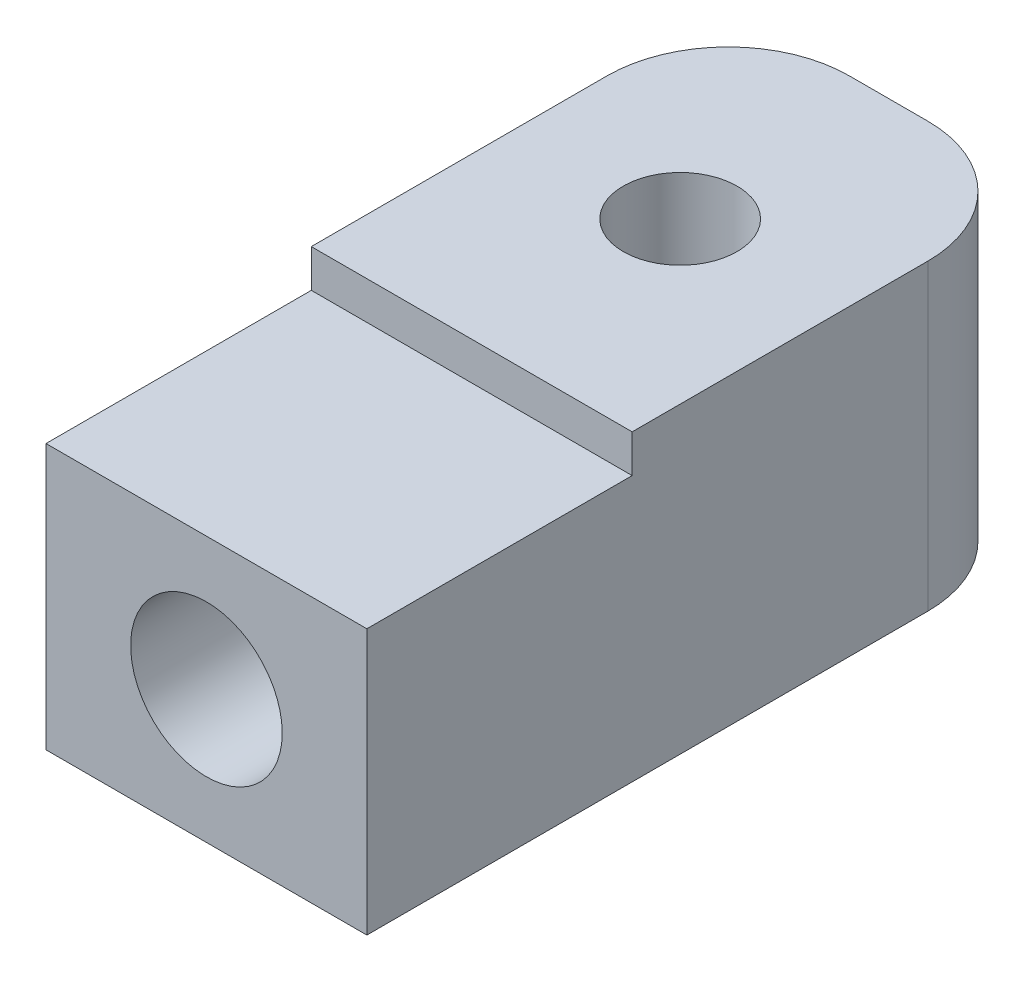
ISO-10303-21;
HEADER;
FILE_DESCRIPTION(('STEP AP214'),'2;1');
FILE_NAME('part.step','',(''),(''),'','','');
FILE_SCHEMA(('AUTOMOTIVE_DESIGN { 1 0 10303 214 1 1 1 1 }'));
ENDSEC;
DATA;
#1=APPLICATION_CONTEXT('core data for automotive mechanical design processes');
#2=APPLICATION_PROTOCOL_DEFINITION('international standard','automotive_design',2000,#1);
#3=PRODUCT_CONTEXT('',#1,'mechanical');
#4=PRODUCT('Part','Part','',(#3));
#5=PRODUCT_RELATED_PRODUCT_CATEGORY('part','',(#4));
#6=PRODUCT_DEFINITION_FORMATION('','',#4);
#7=PRODUCT_DEFINITION_CONTEXT('part definition',#1,'design');
#8=PRODUCT_DEFINITION('design','',#6,#7);
#9=PRODUCT_DEFINITION_SHAPE('','',#8);
#10=(LENGTH_UNIT() NAMED_UNIT(*) SI_UNIT(.MILLI.,.METRE.));
#11=(NAMED_UNIT(*) PLANE_ANGLE_UNIT() SI_UNIT($,.RADIAN.));
#12=(NAMED_UNIT(*) SI_UNIT($,.STERADIAN.) SOLID_ANGLE_UNIT());
#13=UNCERTAINTY_MEASURE_WITH_UNIT(LENGTH_MEASURE(1.E-05),#10,'distance_accuracy_value','');
#14=(GEOMETRIC_REPRESENTATION_CONTEXT(3) GLOBAL_UNCERTAINTY_ASSIGNED_CONTEXT((#13)) GLOBAL_UNIT_ASSIGNED_CONTEXT((#10,
#11,#12)) REPRESENTATION_CONTEXT('',''));
#15=CARTESIAN_POINT('',(0.,0.,0.));
#16=DIRECTION('',(0.,0.,1.));
#17=DIRECTION('',(1.,0.,0.));
#18=AXIS2_PLACEMENT_3D('',#15,#16,#17);
#19=CARTESIAN_POINT('',(-110.647826802209,1000.,0.));
#20=DIRECTION('',(-1.,0.,0.));
#21=DIRECTION('',(0.,0.,1.));
#22=AXIS2_PLACEMENT_3D('',#19,#20,#21);
#23=PLANE('',#22);
#24=DIRECTION('',(0.,0.,-1.));
#25=VECTOR('',#24,1.);
#26=CARTESIAN_POINT('',(-110.647826802209,1000.,0.));
#27=LINE('',#26,#25);
#28=CARTESIAN_POINT('',(-110.647826802209,1000.,444.08422626617));
#29=VERTEX_POINT('',#28);
#30=CARTESIAN_POINT('',(-110.647826802209,1000.,-530.915773733829));
#31=VERTEX_POINT('',#30);
#32=EDGE_CURVE('E134',#29,#31,#27,.T.);
#33=ORIENTED_EDGE('',*,*,#32,.T.);
#34=DIRECTION('',(0.,-1.,0.));
#35=VECTOR('',#34,1.);
#36=CARTESIAN_POINT('',(-110.647826802209,0.,-530.915773733829));
#37=LINE('',#36,#35);
#38=CARTESIAN_POINT('',(-110.647826802209,0.,-530.915773733829));
#39=VERTEX_POINT('',#38);
#40=EDGE_CURVE('E152',#31,#39,#37,.T.);
#41=ORIENTED_EDGE('',*,*,#40,.T.);
#42=DIRECTION('',(0.,0.,-1.));
#43=VECTOR('',#42,1.);
#44=CARTESIAN_POINT('',(-110.647826802209,0.,0.));
#45=LINE('',#44,#43);
#46=CARTESIAN_POINT('',(-110.647826802209,0.,1319.08422626617));
#47=VERTEX_POINT('',#46);
#48=EDGE_CURVE('E106',#47,#39,#45,.T.);
#49=ORIENTED_EDGE('',*,*,#48,.F.);
#50=DIRECTION('',(0.,-1.,0.));
#51=VECTOR('',#50,1.);
#52=CARTESIAN_POINT('',(-110.647826802209,875.,1319.08422626617));
#53=LINE('',#52,#51);
#54=CARTESIAN_POINT('',(-110.647826802209,875.,1319.08422626617));
#55=VERTEX_POINT('',#54);
#56=EDGE_CURVE('E99',#55,#47,#53,.T.);
#57=ORIENTED_EDGE('',*,*,#56,.F.);
#58=DIRECTION('',(0.,0.,-1.));
#59=VECTOR('',#58,1.);
#60=CARTESIAN_POINT('',(-110.647826802209,875.,0.));
#61=LINE('',#60,#59);
#62=CARTESIAN_POINT('',(-110.647826802209,875.,444.08422626617));
#63=VERTEX_POINT('',#62);
#64=EDGE_CURVE('E102',#55,#63,#61,.T.);
#65=ORIENTED_EDGE('',*,*,#64,.T.);
#66=DIRECTION('',(0.,-1.,0.));
#67=VECTOR('',#66,1.);
#68=CARTESIAN_POINT('',(-110.647826802209,1000.,444.08422626617));
#69=LINE('',#68,#67);
#70=EDGE_CURVE('E150',#29,#63,#69,.T.);
#71=ORIENTED_EDGE('',*,*,#70,.F.);
#72=EDGE_LOOP('',(#33,#41,#49,#57,#65,#71));
#73=FACE_BOUND('',#72,.T.);
#74=ADVANCED_FACE('F33',(#73),#23,.T.);
#75=CARTESIAN_POINT('',(0.,1000.,444.08422626617));
#76=DIRECTION('',(0.,0.,-1.));
#77=DIRECTION('',(-1.,0.,0.));
#78=AXIS2_PLACEMENT_3D('',#75,#76,#77);
#79=PLANE('',#78);
#80=ORIENTED_EDGE('',*,*,#70,.T.);
#81=DIRECTION('',(1.,0.,0.));
#82=VECTOR('',#81,1.);
#83=CARTESIAN_POINT('',(0.,875.,444.08422626617));
#84=LINE('',#83,#82);
#85=CARTESIAN_POINT('',(947.649778023491,875.,444.08422626617));
#86=VERTEX_POINT('',#85);
#87=EDGE_CURVE('E118',#63,#86,#84,.T.);
#88=ORIENTED_EDGE('',*,*,#87,.T.);
#89=DIRECTION('',(0.,-1.,0.));
#90=VECTOR('',#89,1.);
#91=CARTESIAN_POINT('',(947.649778023491,1000.,444.08422626617));
#92=LINE('',#91,#90);
#93=CARTESIAN_POINT('',(947.649778023491,1000.,444.08422626617));
#94=VERTEX_POINT('',#93);
#95=EDGE_CURVE('E143',#94,#86,#92,.T.);
#96=ORIENTED_EDGE('',*,*,#95,.F.);
#97=DIRECTION('',(1.,0.,0.));
#98=VECTOR('',#97,1.);
#99=CARTESIAN_POINT('',(0.,1000.,444.08422626617));
#100=LINE('',#99,#98);
#101=EDGE_CURVE('E136',#29,#94,#100,.T.);
#102=ORIENTED_EDGE('',*,*,#101,.F.);
#103=EDGE_LOOP('',(#80,#88,#96,#102));
#104=FACE_BOUND('',#103,.T.);
#105=ADVANCED_FACE('F181',(#104),#79,.F.);
#106=CARTESIAN_POINT('',(947.649778023491,1000.,0.));
#107=DIRECTION('',(-1.,0.,0.));
#108=DIRECTION('',(0.,0.,1.));
#109=AXIS2_PLACEMENT_3D('',#106,#107,#108);
#110=PLANE('',#109);
#111=DIRECTION('',(0.,0.,-1.));
#112=VECTOR('',#111,1.);
#113=CARTESIAN_POINT('',(947.649778023491,0.,0.));
#114=LINE('',#113,#112);
#115=CARTESIAN_POINT('',(947.649778023491,0.,1319.08422626617));
#116=VERTEX_POINT('',#115);
#117=CARTESIAN_POINT('',(947.649778023491,0.,-530.915773733829));
#118=VERTEX_POINT('',#117);
#119=EDGE_CURVE('E145',#116,#118,#114,.T.);
#120=ORIENTED_EDGE('',*,*,#119,.T.);
#121=DIRECTION('',(0.,-1.,0.));
#122=VECTOR('',#121,1.);
#123=CARTESIAN_POINT('',(947.649778023491,1000.,-530.915773733829));
#124=LINE('',#123,#122);
#125=CARTESIAN_POINT('',(947.649778023491,1000.,-530.915773733829));
#126=VERTEX_POINT('',#125);
#127=EDGE_CURVE('E11',#118,#126,#124,.F.);
#128=ORIENTED_EDGE('',*,*,#127,.T.);
#129=DIRECTION('',(0.,0.,-1.));
#130=VECTOR('',#129,1.);
#131=CARTESIAN_POINT('',(947.649778023491,1000.,0.));
#132=LINE('',#131,#130);
#133=EDGE_CURVE('E139',#94,#126,#132,.T.);
#134=ORIENTED_EDGE('',*,*,#133,.F.);
#135=ORIENTED_EDGE('',*,*,#95,.T.);
#136=DIRECTION('',(0.,0.,-1.));
#137=VECTOR('',#136,1.);
#138=CARTESIAN_POINT('',(947.649778023491,875.,0.));
#139=LINE('',#138,#137);
#140=CARTESIAN_POINT('',(947.649778023491,875.,1319.08422626617));
#141=VERTEX_POINT('',#140);
#142=EDGE_CURVE('E125',#141,#86,#139,.T.);
#143=ORIENTED_EDGE('',*,*,#142,.F.);
#144=DIRECTION('',(0.,-1.,0.));
#145=VECTOR('',#144,1.);
#146=CARTESIAN_POINT('',(947.649778023491,875.,1319.08422626617));
#147=LINE('',#146,#145);
#148=EDGE_CURVE('E111',#141,#116,#147,.T.);
#149=ORIENTED_EDGE('',*,*,#148,.T.);
#150=EDGE_LOOP('',(#120,#128,#134,#135,#143,#149));
#151=FACE_BOUND('',#150,.T.);
#152=ADVANCED_FACE('F178',(#151),#110,.F.);
#153=CARTESIAN_POINT('',(-1.95318239647015E-13,1000.,-930.915773733829));
#154=DIRECTION('',(0.,0.,1.));
#155=DIRECTION('',(1.,0.,0.));
#156=AXIS2_PLACEMENT_3D('',#153,#154,#155);
#157=PLANE('',#156);
#158=DIRECTION('',(-1.,0.,0.));
#159=VECTOR('',#158,1.);
#160=CARTESIAN_POINT('',(-1.95318239647015E-13,0.,-930.915773733829));
#161=LINE('',#160,#159);
#162=CARTESIAN_POINT('',(547.649778023491,0.,-930.915773733829));
#163=VERTEX_POINT('',#162);
#164=CARTESIAN_POINT('',(289.352173197791,0.,-930.915773733829));
#165=VERTEX_POINT('',#164);
#166=EDGE_CURVE('E137',#163,#165,#161,.T.);
#167=ORIENTED_EDGE('',*,*,#166,.T.);
#168=DIRECTION('',(0.,-1.,0.));
#169=VECTOR('',#168,1.);
#170=CARTESIAN_POINT('',(289.352173197791,1000.,-930.915773733829));
#171=LINE('',#170,#169);
#172=CARTESIAN_POINT('',(289.352173197791,1000.,-930.915773733829));
#173=VERTEX_POINT('',#172);
#174=EDGE_CURVE('E54',#165,#173,#171,.F.);
#175=ORIENTED_EDGE('',*,*,#174,.T.);
#176=DIRECTION('',(-1.,0.,0.));
#177=VECTOR('',#176,1.);
#178=CARTESIAN_POINT('',(-1.95318239647015E-13,1000.,-930.915773733829));
#179=LINE('',#178,#177);
#180=CARTESIAN_POINT('',(547.649778023491,1000.,-930.915773733829));
#181=VERTEX_POINT('',#180);
#182=EDGE_CURVE('E141',#181,#173,#179,.T.);
#183=ORIENTED_EDGE('',*,*,#182,.F.);
#184=DIRECTION('',(0.,-1.,0.));
#185=VECTOR('',#184,1.);
#186=CARTESIAN_POINT('',(547.649778023491,1000.,-930.915773733829));
#187=LINE('',#186,#185);
#188=EDGE_CURVE('E158',#181,#163,#187,.T.);
#189=ORIENTED_EDGE('',*,*,#188,.T.);
#190=EDGE_LOOP('',(#167,#175,#183,#189));
#191=FACE_BOUND('',#190,.T.);
#192=ADVANCED_FACE('F174',(#191),#157,.F.);
#193=CARTESIAN_POINT('',(0.,1000.,0.));
#194=DIRECTION('',(0.,1.,0.));
#195=DIRECTION('',(0.,0.,1.));
#196=AXIS2_PLACEMENT_3D('',#193,#194,#195);
#197=PLANE('',#196);
#198=CARTESIAN_POINT('',(418.500975610641,1000.,-243.415773733829));
#199=DIRECTION('',(0.,1.,0.));
#200=DIRECTION('',(0.,0.,1.));
#201=AXIS2_PLACEMENT_3D('',#198,#199,#200);
#202=CIRCLE('',#201,187.5);
#203=CARTESIAN_POINT('',(418.500975610641,1000.,-55.9157737338296));
#204=VERTEX_POINT('',#203);
#205=EDGE_CURVE('E341',#204,#204,#202,.T.);
#206=ORIENTED_EDGE('',*,*,#205,.F.);
#207=EDGE_LOOP('',(#206));
#208=FACE_BOUND('',#207,.T.);
#209=ORIENTED_EDGE('',*,*,#182,.T.);
#210=CARTESIAN_POINT('',(289.352173197791,1000.,-530.915773733829));
#211=DIRECTION('',(0.,1.,0.));
#212=DIRECTION('',(0.,0.,1.));
#213=AXIS2_PLACEMENT_3D('',#210,#211,#212);
#214=CIRCLE('',#213,400.);
#215=EDGE_CURVE('E41',#173,#31,#214,.T.);
#216=ORIENTED_EDGE('',*,*,#215,.T.);
#217=ORIENTED_EDGE('',*,*,#32,.F.);
#218=ORIENTED_EDGE('',*,*,#101,.T.);
#219=ORIENTED_EDGE('',*,*,#133,.T.);
#220=CARTESIAN_POINT('',(547.649778023491,1000.,-530.915773733829));
#221=DIRECTION('',(0.,1.,0.));
#222=DIRECTION('',(0.,0.,1.));
#223=AXIS2_PLACEMENT_3D('',#220,#221,#222);
#224=CIRCLE('',#223,400.);
#225=EDGE_CURVE('E162',#126,#181,#224,.T.);
#226=ORIENTED_EDGE('',*,*,#225,.T.);
#227=EDGE_LOOP('',(#209,#216,#217,#218,#219,#226));
#228=FACE_BOUND('',#227,.T.);
#229=ADVANCED_FACE('F166',(#208,#228),#197,.T.);
#230=CARTESIAN_POINT('',(0.,0.,0.));
#231=DIRECTION('',(0.,1.,0.));
#232=DIRECTION('',(0.,0.,1.));
#233=AXIS2_PLACEMENT_3D('',#230,#231,#232);
#234=PLANE('',#233);
#235=CARTESIAN_POINT('',(418.500975610641,0.,-243.415773733829));
#236=DIRECTION('',(0.,-1.,0.));
#237=DIRECTION('',(0.,0.,-1.));
#238=AXIS2_PLACEMENT_3D('',#235,#236,#237);
#239=CIRCLE('',#238,237.5);
#240=CARTESIAN_POINT('',(418.500975610641,0.,-480.915773733829));
#241=VERTEX_POINT('',#240);
#242=EDGE_CURVE('E332',#241,#241,#239,.T.);
#243=ORIENTED_EDGE('',*,*,#242,.F.);
#244=EDGE_LOOP('',(#243));
#245=FACE_BOUND('',#244,.T.);
#246=ORIENTED_EDGE('',*,*,#48,.T.);
#247=CARTESIAN_POINT('',(289.352173197791,0.,-530.915773733829));
#248=DIRECTION('',(0.,1.,0.));
#249=DIRECTION('',(0.,0.,1.));
#250=AXIS2_PLACEMENT_3D('',#247,#248,#249);
#251=CIRCLE('',#250,400.);
#252=EDGE_CURVE('E156',#39,#165,#251,.F.);
#253=ORIENTED_EDGE('',*,*,#252,.T.);
#254=ORIENTED_EDGE('',*,*,#166,.F.);
#255=CARTESIAN_POINT('',(547.649778023491,0.,-530.915773733829));
#256=DIRECTION('',(0.,1.,0.));
#257=DIRECTION('',(0.,0.,1.));
#258=AXIS2_PLACEMENT_3D('',#255,#256,#257);
#259=CIRCLE('',#258,400.);
#260=EDGE_CURVE('E154',#163,#118,#259,.F.);
#261=ORIENTED_EDGE('',*,*,#260,.T.);
#262=ORIENTED_EDGE('',*,*,#119,.F.);
#263=DIRECTION('',(-1.,0.,0.));
#264=VECTOR('',#263,1.);
#265=CARTESIAN_POINT('',(0.,0.,1319.08422626617));
#266=LINE('',#265,#264);
#267=EDGE_CURVE('E120',#116,#47,#266,.T.);
#268=ORIENTED_EDGE('',*,*,#267,.T.);
#269=EDGE_LOOP('',(#246,#253,#254,#261,#262,#268));
#270=FACE_BOUND('',#269,.T.);
#271=ADVANCED_FACE('F173',(#245,#270),#234,.F.);
#272=CARTESIAN_POINT('',(0.,875.,1319.08422626617));
#273=DIRECTION('',(0.,0.,1.));
#274=DIRECTION('',(1.,0.,0.));
#275=AXIS2_PLACEMENT_3D('',#272,#273,#274);
#276=PLANE('',#275);
#277=CARTESIAN_POINT('',(418.500975610641,437.5,1319.08422626617));
#278=DIRECTION('',(0.,0.,1.));
#279=DIRECTION('',(1.,0.,0.));
#280=AXIS2_PLACEMENT_3D('',#277,#278,#279);
#281=CIRCLE('',#280,250.);
#282=CARTESIAN_POINT('',(668.500975610641,437.5,1319.08422626617));
#283=VERTEX_POINT('',#282);
#284=EDGE_CURVE('E344',#283,#283,#281,.T.);
#285=ORIENTED_EDGE('',*,*,#284,.F.);
#286=EDGE_LOOP('',(#285));
#287=FACE_BOUND('',#286,.T.);
#288=ORIENTED_EDGE('',*,*,#267,.F.);
#289=ORIENTED_EDGE('',*,*,#148,.F.);
#290=DIRECTION('',(-1.,0.,0.));
#291=VECTOR('',#290,1.);
#292=CARTESIAN_POINT('',(0.,875.,1319.08422626617));
#293=LINE('',#292,#291);
#294=EDGE_CURVE('E116',#141,#55,#293,.T.);
#295=ORIENTED_EDGE('',*,*,#294,.T.);
#296=ORIENTED_EDGE('',*,*,#56,.T.);
#297=EDGE_LOOP('',(#288,#289,#295,#296));
#298=FACE_BOUND('',#297,.T.);
#299=ADVANCED_FACE('F122',(#287,#298),#276,.T.);
#300=CARTESIAN_POINT('',(0.,875.,0.));
#301=DIRECTION('',(0.,1.,0.));
#302=DIRECTION('',(0.,0.,1.));
#303=AXIS2_PLACEMENT_3D('',#300,#301,#302);
#304=PLANE('',#303);
#305=ORIENTED_EDGE('',*,*,#64,.F.);
#306=ORIENTED_EDGE('',*,*,#294,.F.);
#307=ORIENTED_EDGE('',*,*,#142,.T.);
#308=ORIENTED_EDGE('',*,*,#87,.F.);
#309=EDGE_LOOP('',(#305,#306,#307,#308));
#310=FACE_BOUND('',#309,.T.);
#311=ADVANCED_FACE('F115',(#310),#304,.T.);
#312=CARTESIAN_POINT('',(418.500975610641,437.5,131.08422626617));
#313=DIRECTION('',(0.,0.,1.));
#314=DIRECTION('',(1.,0.,0.));
#315=AXIS2_PLACEMENT_3D('',#312,#313,#314);
#316=CYLINDRICAL_SURFACE('',#315,250.);
#317=CARTESIAN_POINT('',(418.500975610641,437.5,131.08422626617));
#318=DIRECTION('',(0.,0.,1.));
#319=DIRECTION('',(1.,0.,0.));
#320=AXIS2_PLACEMENT_3D('',#317,#318,#319);
#321=CIRCLE('',#320,250.);
#322=CARTESIAN_POINT('',(668.500975610641,437.5,131.08422626617));
#323=VERTEX_POINT('',#322);
#324=EDGE_CURVE('E132',#323,#323,#321,.T.);
#325=ORIENTED_EDGE('',*,*,#324,.F.);
#326=EDGE_LOOP('',(#325));
#327=FACE_BOUND('',#326,.T.);
#328=ORIENTED_EDGE('',*,*,#284,.T.);
#329=EDGE_LOOP('',(#328));
#330=FACE_BOUND('',#329,.T.);
#331=ADVANCED_FACE('F215',(#327,#330),#316,.F.);
#332=CARTESIAN_POINT('',(418.500975610641,437.5,131.08422626617));
#333=DIRECTION('',(0.,0.,1.));
#334=DIRECTION('',(1.,0.,0.));
#335=AXIS2_PLACEMENT_3D('',#332,#333,#334);
#336=PLANE('',#335);
#337=ORIENTED_EDGE('',*,*,#324,.T.);
#338=EDGE_LOOP('',(#337));
#339=FACE_BOUND('',#338,.T.);
#340=ADVANCED_FACE('F211',(#339),#336,.T.);
#341=CARTESIAN_POINT('',(418.500975610641,125.,-243.415773733829));
#342=DIRECTION('',(0.,1.,0.));
#343=DIRECTION('',(0.,0.,1.));
#344=AXIS2_PLACEMENT_3D('',#341,#342,#343);
#345=CYLINDRICAL_SURFACE('',#344,187.5);
#346=CARTESIAN_POINT('',(418.500975610641,125.,-243.415773733829));
#347=DIRECTION('',(0.,1.,0.));
#348=DIRECTION('',(0.,0.,1.));
#349=AXIS2_PLACEMENT_3D('',#346,#347,#348);
#350=CIRCLE('',#349,187.5);
#351=CARTESIAN_POINT('',(418.500975610641,125.,-55.9157737338296));
#352=VERTEX_POINT('',#351);
#353=EDGE_CURVE('E336',#352,#352,#350,.T.);
#354=ORIENTED_EDGE('',*,*,#353,.F.);
#355=EDGE_LOOP('',(#354));
#356=FACE_BOUND('',#355,.T.);
#357=ORIENTED_EDGE('',*,*,#205,.T.);
#358=EDGE_LOOP('',(#357));
#359=FACE_BOUND('',#358,.T.);
#360=ADVANCED_FACE('F203',(#356,#359),#345,.F.);
#361=CARTESIAN_POINT('',(418.500975610641,125.,-243.415773733829));
#362=DIRECTION('',(0.,-1.,0.));
#363=DIRECTION('',(0.,0.,-1.));
#364=AXIS2_PLACEMENT_3D('',#361,#362,#363);
#365=PLANE('',#364);
#366=CARTESIAN_POINT('',(418.500975610641,125.,-243.415773733829));
#367=DIRECTION('',(0.,-1.,0.));
#368=DIRECTION('',(0.,0.,-1.));
#369=AXIS2_PLACEMENT_3D('',#366,#367,#368);
#370=CIRCLE('',#369,237.5);
#371=CARTESIAN_POINT('',(418.500975610641,125.,-480.915773733829));
#372=VERTEX_POINT('',#371);
#373=EDGE_CURVE('E333',#372,#372,#370,.T.);
#374=ORIENTED_EDGE('',*,*,#373,.T.);
#375=EDGE_LOOP('',(#374));
#376=FACE_BOUND('',#375,.T.);
#377=ORIENTED_EDGE('',*,*,#353,.T.);
#378=EDGE_LOOP('',(#377));
#379=FACE_BOUND('',#378,.T.);
#380=ADVANCED_FACE('F197',(#376,#379),#365,.T.);
#381=CARTESIAN_POINT('',(418.500975610641,125.,-243.415773733829));
#382=DIRECTION('',(0.,-1.,0.));
#383=DIRECTION('',(0.,0.,-1.));
#384=AXIS2_PLACEMENT_3D('',#381,#382,#383);
#385=CYLINDRICAL_SURFACE('',#384,237.5);
#386=ORIENTED_EDGE('',*,*,#373,.F.);
#387=EDGE_LOOP('',(#386));
#388=FACE_BOUND('',#387,.T.);
#389=ORIENTED_EDGE('',*,*,#242,.T.);
#390=EDGE_LOOP('',(#389));
#391=FACE_BOUND('',#390,.T.);
#392=ADVANCED_FACE('F192',(#388,#391),#385,.F.);
#393=CARTESIAN_POINT('',(289.352173197791,1000.,-530.915773733829));
#394=DIRECTION('',(0.,1.,0.));
#395=DIRECTION('',(0.,0.,1.));
#396=AXIS2_PLACEMENT_3D('',#393,#394,#395);
#397=CYLINDRICAL_SURFACE('',#396,400.);
#398=ORIENTED_EDGE('',*,*,#215,.F.);
#399=ORIENTED_EDGE('',*,*,#174,.F.);
#400=ORIENTED_EDGE('',*,*,#252,.F.);
#401=ORIENTED_EDGE('',*,*,#40,.F.);
#402=EDGE_LOOP('',(#398,#399,#400,#401));
#403=FACE_BOUND('',#402,.T.);
#404=ADVANCED_FACE('F170',(#403),#397,.T.);
#405=CARTESIAN_POINT('',(547.649778023491,1000.,-530.915773733829));
#406=DIRECTION('',(0.,-1.,0.));
#407=DIRECTION('',(0.,0.,-1.));
#408=AXIS2_PLACEMENT_3D('',#405,#406,#407);
#409=CYLINDRICAL_SURFACE('',#408,400.);
#410=ORIENTED_EDGE('',*,*,#225,.F.);
#411=ORIENTED_EDGE('',*,*,#127,.F.);
#412=ORIENTED_EDGE('',*,*,#260,.F.);
#413=ORIENTED_EDGE('',*,*,#188,.F.);
#414=EDGE_LOOP('',(#410,#411,#412,#413));
#415=FACE_BOUND('',#414,.T.);
#416=ADVANCED_FACE('F35',(#415),#409,.T.);
#417=CLOSED_SHELL('',(#74,#105,#152,#192,#229,#271,#299,#311,#331,#340,#360,#380,#392,#404,#416));
#418=MANIFOLD_SOLID_BREP('B2',#417);
#419=ADVANCED_BREP_SHAPE_REPRESENTATION('',(#18,#418),#14);
#420=SHAPE_DEFINITION_REPRESENTATION(#9,#419);
ENDSEC;
END-ISO-10303-21;
